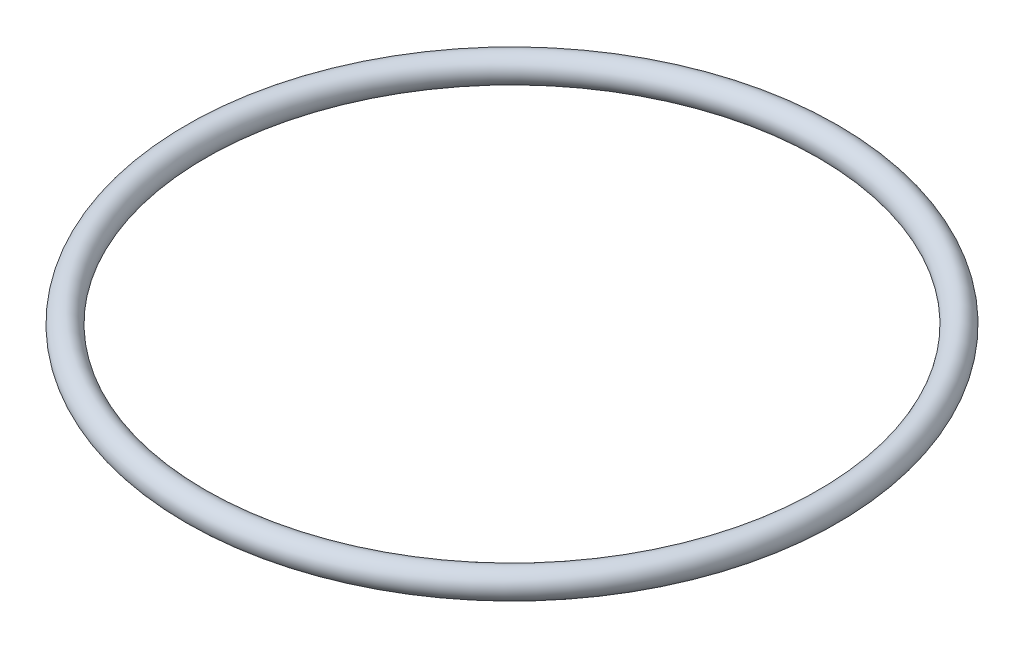
ISO-10303-21;
HEADER;
FILE_DESCRIPTION(('STEP AP214'),'2;1');
FILE_NAME('part.step','',(''),(''),'','','');
FILE_SCHEMA(('AUTOMOTIVE_DESIGN { 1 0 10303 214 1 1 1 1 }'));
ENDSEC;
DATA;
#1=APPLICATION_CONTEXT('core data for automotive mechanical design processes');
#2=APPLICATION_PROTOCOL_DEFINITION('international standard','automotive_design',2000,#1);
#3=PRODUCT_CONTEXT('',#1,'mechanical');
#4=PRODUCT('Part','Part','',(#3));
#5=PRODUCT_RELATED_PRODUCT_CATEGORY('part','',(#4));
#6=PRODUCT_DEFINITION_FORMATION('','',#4);
#7=PRODUCT_DEFINITION_CONTEXT('part definition',#1,'design');
#8=PRODUCT_DEFINITION('design','',#6,#7);
#9=PRODUCT_DEFINITION_SHAPE('','',#8);
#10=(LENGTH_UNIT() NAMED_UNIT(*) SI_UNIT(.MILLI.,.METRE.));
#11=(NAMED_UNIT(*) PLANE_ANGLE_UNIT() SI_UNIT($,.RADIAN.));
#12=(NAMED_UNIT(*) SI_UNIT($,.STERADIAN.) SOLID_ANGLE_UNIT());
#13=UNCERTAINTY_MEASURE_WITH_UNIT(LENGTH_MEASURE(1.E-05),#10,'distance_accuracy_value','');
#14=(GEOMETRIC_REPRESENTATION_CONTEXT(3) GLOBAL_UNCERTAINTY_ASSIGNED_CONTEXT((#13)) GLOBAL_UNIT_ASSIGNED_CONTEXT((#10,
#11,#12)) REPRESENTATION_CONTEXT('',''));
#15=CARTESIAN_POINT('',(0.,0.,0.));
#16=DIRECTION('',(0.,0.,1.));
#17=DIRECTION('',(1.,0.,0.));
#18=AXIS2_PLACEMENT_3D('',#15,#16,#17);
#19=CARTESIAN_POINT('',(0.,0.,0.));
#20=DIRECTION('',(0.,-1.,0.));
#21=DIRECTION('',(0.,0.,-1.));
#22=AXIS2_PLACEMENT_3D('',#19,#20,#21);
#23=TOROIDAL_SURFACE('',#22,37.30625,1.5875);
#24=CARTESIAN_POINT('',(0.,0.,-38.89375));
#25=VERTEX_POINT('',#24);
#26=VERTEX_LOOP('',#25);
#27=FACE_BOUND('',#26,.T.);
#28=ADVANCED_FACE('F36',(#27),#23,.T.);
#29=CLOSED_SHELL('',(#28));
#30=MANIFOLD_SOLID_BREP('B2',#29);
#31=ADVANCED_BREP_SHAPE_REPRESENTATION('',(#18,#30),#14);
#32=SHAPE_DEFINITION_REPRESENTATION(#9,#31);
ENDSEC;
END-ISO-10303-21;
